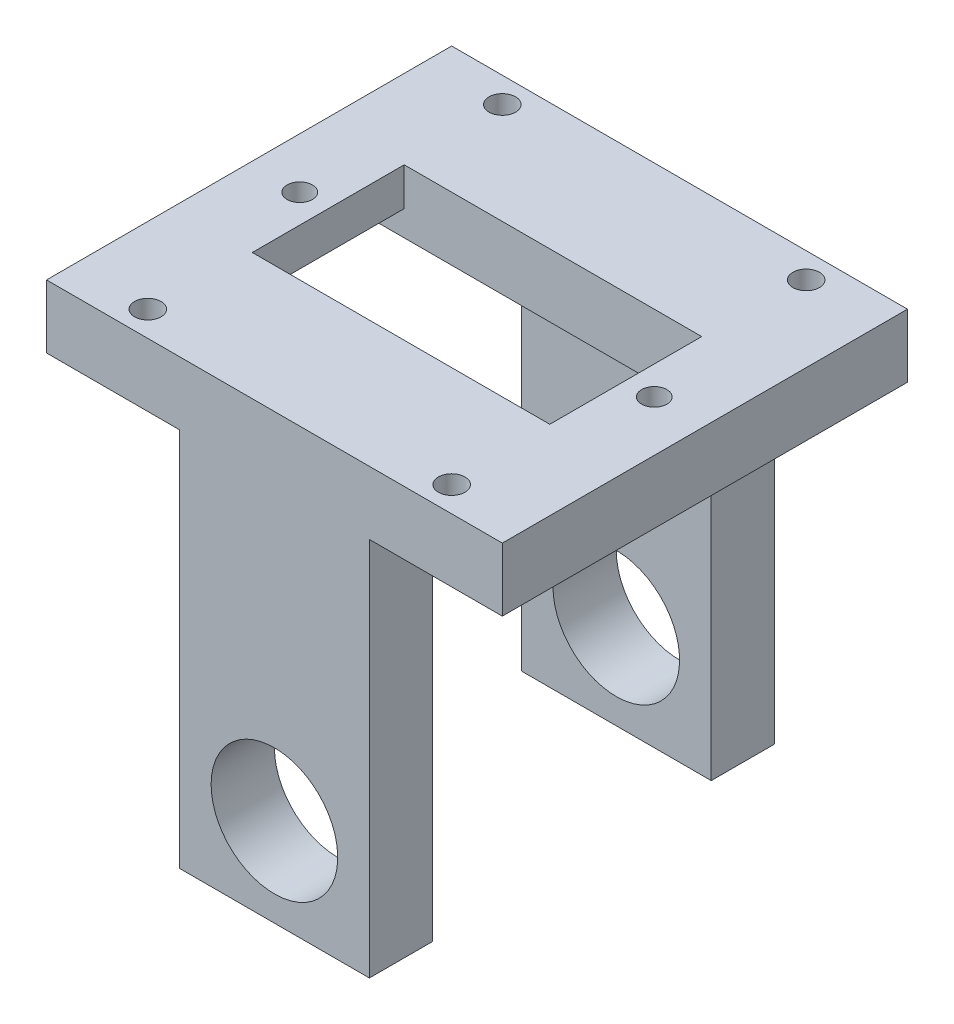
ISO-10303-21;
HEADER;
FILE_DESCRIPTION(('STEP AP214'),'2;1');
FILE_NAME('part.step','',(''),(''),'','','');
FILE_SCHEMA(('AUTOMOTIVE_DESIGN { 1 0 10303 214 1 1 1 1 }'));
ENDSEC;
DATA;
#1=APPLICATION_CONTEXT('core data for automotive mechanical design processes');
#2=APPLICATION_PROTOCOL_DEFINITION('international standard','automotive_design',2000,#1);
#3=PRODUCT_CONTEXT('',#1,'mechanical');
#4=PRODUCT('Part','Part','',(#3));
#5=PRODUCT_RELATED_PRODUCT_CATEGORY('part','',(#4));
#6=PRODUCT_DEFINITION_FORMATION('','',#4);
#7=PRODUCT_DEFINITION_CONTEXT('part definition',#1,'design');
#8=PRODUCT_DEFINITION('design','',#6,#7);
#9=PRODUCT_DEFINITION_SHAPE('','',#8);
#10=(LENGTH_UNIT() NAMED_UNIT(*) SI_UNIT(.MILLI.,.METRE.));
#11=(NAMED_UNIT(*) PLANE_ANGLE_UNIT() SI_UNIT($,.RADIAN.));
#12=(NAMED_UNIT(*) SI_UNIT($,.STERADIAN.) SOLID_ANGLE_UNIT());
#13=UNCERTAINTY_MEASURE_WITH_UNIT(LENGTH_MEASURE(1.E-05),#10,'distance_accuracy_value','');
#14=(GEOMETRIC_REPRESENTATION_CONTEXT(3) GLOBAL_UNCERTAINTY_ASSIGNED_CONTEXT((#13)) GLOBAL_UNIT_ASSIGNED_CONTEXT((#10,
#11,#12)) REPRESENTATION_CONTEXT('',''));
#15=CARTESIAN_POINT('',(0.,0.,0.));
#16=DIRECTION('',(0.,0.,1.));
#17=DIRECTION('',(1.,0.,0.));
#18=AXIS2_PLACEMENT_3D('',#15,#16,#17);
#19=CARTESIAN_POINT('',(0.,0.,0.));
#20=DIRECTION('',(0.,1.,0.));
#21=DIRECTION('',(0.,0.,1.));
#22=AXIS2_PLACEMENT_3D('',#19,#20,#21);
#23=PLANE('',#22);
#24=CARTESIAN_POINT('',(-12.,0.,-14.));
#25=DIRECTION('',(0.,-1.,0.));
#26=DIRECTION('',(0.,0.,1.));
#27=AXIS2_PLACEMENT_3D('',#24,#25,#26);
#28=CIRCLE('',#27,1.05);
#29=CARTESIAN_POINT('',(-12.,0.,-12.95));
#30=VERTEX_POINT('',#29);
#31=EDGE_CURVE('E425',#30,#30,#28,.T.);
#32=ORIENTED_EDGE('',*,*,#31,.F.);
#33=EDGE_LOOP('',(#32));
#34=FACE_BOUND('',#33,.T.);
#35=CARTESIAN_POINT('',(12.,0.,-14.));
#36=DIRECTION('',(0.,-1.,0.));
#37=DIRECTION('',(0.,0.,-1.));
#38=AXIS2_PLACEMENT_3D('',#35,#36,#37);
#39=CIRCLE('',#38,1.05);
#40=CARTESIAN_POINT('',(12.,0.,-15.05));
#41=VERTEX_POINT('',#40);
#42=EDGE_CURVE('E431',#41,#41,#39,.T.);
#43=ORIENTED_EDGE('',*,*,#42,.F.);
#44=EDGE_LOOP('',(#43));
#45=FACE_BOUND('',#44,.T.);
#46=CARTESIAN_POINT('',(12.,0.,14.));
#47=DIRECTION('',(0.,-1.,0.));
#48=DIRECTION('',(0.,0.,1.));
#49=AXIS2_PLACEMENT_3D('',#46,#47,#48);
#50=CIRCLE('',#49,1.05);
#51=CARTESIAN_POINT('',(12.,0.,15.05));
#52=VERTEX_POINT('',#51);
#53=EDGE_CURVE('E437',#52,#52,#50,.T.);
#54=ORIENTED_EDGE('',*,*,#53,.F.);
#55=EDGE_LOOP('',(#54));
#56=FACE_BOUND('',#55,.T.);
#57=CARTESIAN_POINT('',(-12.,0.,14.));
#58=DIRECTION('',(0.,-1.,0.));
#59=DIRECTION('',(0.,0.,-1.));
#60=AXIS2_PLACEMENT_3D('',#57,#58,#59);
#61=CIRCLE('',#60,1.05);
#62=CARTESIAN_POINT('',(-12.,0.,12.95));
#63=VERTEX_POINT('',#62);
#64=EDGE_CURVE('E418',#63,#63,#61,.T.);
#65=ORIENTED_EDGE('',*,*,#64,.F.);
#66=EDGE_LOOP('',(#65));
#67=FACE_BOUND('',#66,.T.);
#68=DIRECTION('',(-1.,0.,0.));
#69=VECTOR('',#68,1.);
#70=CARTESIAN_POINT('',(-16.5,0.,6.));
#71=LINE('',#70,#69);
#72=CARTESIAN_POINT('',(16.5,0.,6.));
#73=VERTEX_POINT('',#72);
#74=CARTESIAN_POINT('',(-16.5,0.,6.));
#75=VERTEX_POINT('',#74);
#76=EDGE_CURVE('E287',#73,#75,#71,.T.);
#77=ORIENTED_EDGE('',*,*,#76,.F.);
#78=DIRECTION('',(0.,0.,1.));
#79=VECTOR('',#78,1.);
#80=CARTESIAN_POINT('',(16.5,0.,6.));
#81=LINE('',#80,#79);
#82=CARTESIAN_POINT('',(16.5,0.,-6.));
#83=VERTEX_POINT('',#82);
#84=EDGE_CURVE('E267',#83,#73,#81,.T.);
#85=ORIENTED_EDGE('',*,*,#84,.F.);
#86=DIRECTION('',(1.,0.,0.));
#87=VECTOR('',#86,1.);
#88=CARTESIAN_POINT('',(-16.5,0.,-6.));
#89=LINE('',#88,#87);
#90=CARTESIAN_POINT('',(-16.5,0.,-6.));
#91=VERTEX_POINT('',#90);
#92=EDGE_CURVE('E274',#91,#83,#89,.T.);
#93=ORIENTED_EDGE('',*,*,#92,.F.);
#94=DIRECTION('',(0.,0.,-1.));
#95=VECTOR('',#94,1.);
#96=CARTESIAN_POINT('',(-16.5,0.,6.));
#97=LINE('',#96,#95);
#98=EDGE_CURVE('E289',#75,#91,#97,.T.);
#99=ORIENTED_EDGE('',*,*,#98,.F.);
#100=EDGE_LOOP('',(#77,#85,#93,#99));
#101=FACE_BOUND('',#100,.T.);
#102=DIRECTION('',(0.,0.,-1.));
#103=VECTOR('',#102,1.);
#104=CARTESIAN_POINT('',(-7.49999999999999,0.,-16.));
#105=LINE('',#104,#103);
#106=CARTESIAN_POINT('',(-7.49999999999999,0.,-11.));
#107=VERTEX_POINT('',#106);
#108=CARTESIAN_POINT('',(-7.49999999999999,0.,-16.));
#109=VERTEX_POINT('',#108);
#110=EDGE_CURVE('E57',#107,#109,#105,.T.);
#111=ORIENTED_EDGE('',*,*,#110,.F.);
#112=DIRECTION('',(-1.,0.,0.));
#113=VECTOR('',#112,1.);
#114=CARTESIAN_POINT('',(-7.49999999999999,0.,-11.));
#115=LINE('',#114,#113);
#116=CARTESIAN_POINT('',(7.50000000000001,0.,-11.));
#117=VERTEX_POINT('',#116);
#118=EDGE_CURVE('E181',#117,#107,#115,.T.);
#119=ORIENTED_EDGE('',*,*,#118,.F.);
#120=DIRECTION('',(0.,0.,1.));
#121=VECTOR('',#120,1.);
#122=CARTESIAN_POINT('',(7.50000000000001,0.,-16.));
#123=LINE('',#122,#121);
#124=CARTESIAN_POINT('',(7.50000000000001,0.,-16.));
#125=VERTEX_POINT('',#124);
#126=EDGE_CURVE('E189',#125,#117,#123,.T.);
#127=ORIENTED_EDGE('',*,*,#126,.F.);
#128=DIRECTION('',(-1.,0.,0.));
#129=VECTOR('',#128,1.);
#130=CARTESIAN_POINT('',(-18.,0.,-16.));
#131=LINE('',#130,#129);
#132=CARTESIAN_POINT('',(18.,0.,-16.));
#133=VERTEX_POINT('',#132);
#134=EDGE_CURVE('E317',#133,#125,#131,.T.);
#135=ORIENTED_EDGE('',*,*,#134,.F.);
#136=DIRECTION('',(0.,0.,-1.));
#137=VECTOR('',#136,1.);
#138=CARTESIAN_POINT('',(18.,0.,-16.));
#139=LINE('',#138,#137);
#140=CARTESIAN_POINT('',(18.,0.,16.));
#141=VERTEX_POINT('',#140);
#142=EDGE_CURVE('E296',#141,#133,#139,.T.);
#143=ORIENTED_EDGE('',*,*,#142,.F.);
#144=DIRECTION('',(1.,0.,0.));
#145=VECTOR('',#144,1.);
#146=CARTESIAN_POINT('',(-18.,0.,16.));
#147=LINE('',#146,#145);
#148=CARTESIAN_POINT('',(7.5,0.,16.));
#149=VERTEX_POINT('',#148);
#150=EDGE_CURVE('E322',#149,#141,#147,.T.);
#151=ORIENTED_EDGE('',*,*,#150,.F.);
#152=DIRECTION('',(0.,0.,1.));
#153=VECTOR('',#152,1.);
#154=CARTESIAN_POINT('',(7.5,0.,16.));
#155=LINE('',#154,#153);
#156=CARTESIAN_POINT('',(7.5,0.,11.));
#157=VERTEX_POINT('',#156);
#158=EDGE_CURVE('E65',#157,#149,#155,.T.);
#159=ORIENTED_EDGE('',*,*,#158,.F.);
#160=DIRECTION('',(1.,0.,0.));
#161=VECTOR('',#160,1.);
#162=CARTESIAN_POINT('',(-7.5,0.,11.));
#163=LINE('',#162,#161);
#164=CARTESIAN_POINT('',(-7.5,0.,11.));
#165=VERTEX_POINT('',#164);
#166=EDGE_CURVE('E214',#165,#157,#163,.T.);
#167=ORIENTED_EDGE('',*,*,#166,.F.);
#168=DIRECTION('',(0.,0.,-1.));
#169=VECTOR('',#168,1.);
#170=CARTESIAN_POINT('',(-7.5,0.,16.));
#171=LINE('',#170,#169);
#172=CARTESIAN_POINT('',(-7.5,0.,16.));
#173=VERTEX_POINT('',#172);
#174=EDGE_CURVE('E200',#173,#165,#171,.T.);
#175=ORIENTED_EDGE('',*,*,#174,.F.);
#176=CARTESIAN_POINT('',(-18.,0.,16.));
#177=VERTEX_POINT('',#176);
#178=EDGE_CURVE('E308',#177,#173,#147,.T.);
#179=ORIENTED_EDGE('',*,*,#178,.F.);
#180=DIRECTION('',(0.,0.,1.));
#181=VECTOR('',#180,1.);
#182=CARTESIAN_POINT('',(-18.,0.,-16.));
#183=LINE('',#182,#181);
#184=CARTESIAN_POINT('',(-18.,0.,-16.));
#185=VERTEX_POINT('',#184);
#186=EDGE_CURVE('E320',#185,#177,#183,.T.);
#187=ORIENTED_EDGE('',*,*,#186,.F.);
#188=EDGE_CURVE('E198',#109,#185,#131,.T.);
#189=ORIENTED_EDGE('',*,*,#188,.F.);
#190=EDGE_LOOP('',(#111,#119,#127,#135,#143,#151,#159,#167,#175,#179,#187,#189));
#191=FACE_BOUND('',#190,.T.);
#192=ADVANCED_FACE('F41',(#34,#45,#56,#67,#101,#191),#23,.F.);
#193=CARTESIAN_POINT('',(0.,2.,0.));
#194=DIRECTION('',(0.,-1.,0.));
#195=DIRECTION('',(0.,0.,-1.));
#196=AXIS2_PLACEMENT_3D('',#193,#194,#195);
#197=PLANE('',#196);
#198=DIRECTION('',(0.,0.,-1.));
#199=VECTOR('',#198,1.);
#200=CARTESIAN_POINT('',(-11.75,2.,0.));
#201=LINE('',#200,#199);
#202=CARTESIAN_POINT('',(-11.75,2.,6.));
#203=VERTEX_POINT('',#202);
#204=CARTESIAN_POINT('',(-11.75,2.,-6.));
#205=VERTEX_POINT('',#204);
#206=EDGE_CURVE('E11',#203,#205,#201,.T.);
#207=ORIENTED_EDGE('',*,*,#206,.F.);
#208=DIRECTION('',(-1.,0.,0.));
#209=VECTOR('',#208,1.);
#210=CARTESIAN_POINT('',(-16.5,2.,6.));
#211=LINE('',#210,#209);
#212=CARTESIAN_POINT('',(-16.5,2.,6.));
#213=VERTEX_POINT('',#212);
#214=EDGE_CURVE('E273',#203,#213,#211,.T.);
#215=ORIENTED_EDGE('',*,*,#214,.T.);
#216=DIRECTION('',(0.,0.,-1.));
#217=VECTOR('',#216,1.);
#218=CARTESIAN_POINT('',(-16.5,2.,6.));
#219=LINE('',#218,#217);
#220=CARTESIAN_POINT('',(-16.5,2.,-6.));
#221=VERTEX_POINT('',#220);
#222=EDGE_CURVE('E278',#213,#221,#219,.T.);
#223=ORIENTED_EDGE('',*,*,#222,.T.);
#224=DIRECTION('',(1.,0.,0.));
#225=VECTOR('',#224,1.);
#226=CARTESIAN_POINT('',(-16.5,2.,-6.));
#227=LINE('',#226,#225);
#228=EDGE_CURVE('E282',#221,#205,#227,.T.);
#229=ORIENTED_EDGE('',*,*,#228,.T.);
#230=EDGE_LOOP('',(#207,#215,#223,#229));
#231=FACE_BOUND('',#230,.T.);
#232=CARTESIAN_POINT('',(-14.,2.,0.));
#233=DIRECTION('',(0.,-1.,0.));
#234=DIRECTION('',(0.,0.,-1.));
#235=AXIS2_PLACEMENT_3D('',#232,#233,#234);
#236=CIRCLE('',#235,1.);
#237=CARTESIAN_POINT('',(-14.,2.,-1.));
#238=VERTEX_POINT('',#237);
#239=EDGE_CURVE('E257',#238,#238,#236,.T.);
#240=ORIENTED_EDGE('',*,*,#239,.F.);
#241=EDGE_LOOP('',(#240));
#242=FACE_BOUND('',#241,.T.);
#243=ADVANCED_FACE('F365',(#231,#242),#197,.T.);
#244=CARTESIAN_POINT('',(18.,5.,-16.));
#245=DIRECTION('',(-1.,0.,0.));
#246=DIRECTION('',(0.,0.,1.));
#247=AXIS2_PLACEMENT_3D('',#244,#245,#246);
#248=PLANE('',#247);
#249=ORIENTED_EDGE('',*,*,#142,.T.);
#250=DIRECTION('',(0.,-1.,0.));
#251=VECTOR('',#250,1.);
#252=CARTESIAN_POINT('',(18.,5.,-16.));
#253=LINE('',#252,#251);
#254=CARTESIAN_POINT('',(18.,5.,-16.));
#255=VERTEX_POINT('',#254);
#256=EDGE_CURVE('E333',#255,#133,#253,.T.);
#257=ORIENTED_EDGE('',*,*,#256,.F.);
#258=DIRECTION('',(0.,0.,-1.));
#259=VECTOR('',#258,1.);
#260=CARTESIAN_POINT('',(18.,5.,-16.));
#261=LINE('',#260,#259);
#262=CARTESIAN_POINT('',(18.,5.,16.));
#263=VERTEX_POINT('',#262);
#264=EDGE_CURVE('E304',#263,#255,#261,.T.);
#265=ORIENTED_EDGE('',*,*,#264,.F.);
#266=DIRECTION('',(0.,-1.,0.));
#267=VECTOR('',#266,1.);
#268=CARTESIAN_POINT('',(18.,5.,16.));
#269=LINE('',#268,#267);
#270=EDGE_CURVE('E314',#263,#141,#269,.T.);
#271=ORIENTED_EDGE('',*,*,#270,.T.);
#272=EDGE_LOOP('',(#249,#257,#265,#271));
#273=FACE_BOUND('',#272,.T.);
#274=ADVANCED_FACE('F43',(#273),#248,.F.);
#275=CARTESIAN_POINT('',(-18.,5.,-16.));
#276=DIRECTION('',(0.,0.,1.));
#277=DIRECTION('',(1.,0.,0.));
#278=AXIS2_PLACEMENT_3D('',#275,#276,#277);
#279=PLANE('',#278);
#280=CARTESIAN_POINT('',(0.,-23.,-16.));
#281=DIRECTION('',(0.,0.,-1.));
#282=DIRECTION('',(-1.,0.,0.));
#283=AXIS2_PLACEMENT_3D('',#280,#281,#282);
#284=CIRCLE('',#283,5.);
#285=CARTESIAN_POINT('',(-5.,-23.,-16.));
#286=VERTEX_POINT('',#285);
#287=EDGE_CURVE('E415',#286,#286,#284,.T.);
#288=ORIENTED_EDGE('',*,*,#287,.F.);
#289=EDGE_LOOP('',(#288));
#290=FACE_BOUND('',#289,.T.);
#291=ORIENTED_EDGE('',*,*,#134,.T.);
#292=DIRECTION('',(0.,1.,0.));
#293=VECTOR('',#292,1.);
#294=CARTESIAN_POINT('',(7.50000000000001,-30.,-16.));
#295=LINE('',#294,#293);
#296=CARTESIAN_POINT('',(7.50000000000001,-30.,-16.));
#297=VERTEX_POINT('',#296);
#298=EDGE_CURVE('E403',#297,#125,#295,.T.);
#299=ORIENTED_EDGE('',*,*,#298,.F.);
#300=DIRECTION('',(1.,0.,0.));
#301=VECTOR('',#300,1.);
#302=CARTESIAN_POINT('',(-7.49999999999999,-30.,-16.));
#303=LINE('',#302,#301);
#304=CARTESIAN_POINT('',(-7.49999999999999,-30.,-16.));
#305=VERTEX_POINT('',#304);
#306=EDGE_CURVE('E207',#305,#297,#303,.T.);
#307=ORIENTED_EDGE('',*,*,#306,.F.);
#308=DIRECTION('',(0.,1.,0.));
#309=VECTOR('',#308,1.);
#310=CARTESIAN_POINT('',(-7.49999999999999,-30.,-16.));
#311=LINE('',#310,#309);
#312=EDGE_CURVE('E404',#305,#109,#311,.T.);
#313=ORIENTED_EDGE('',*,*,#312,.T.);
#314=ORIENTED_EDGE('',*,*,#188,.T.);
#315=DIRECTION('',(0.,-1.,0.));
#316=VECTOR('',#315,1.);
#317=CARTESIAN_POINT('',(-18.,5.,-16.));
#318=LINE('',#317,#316);
#319=CARTESIAN_POINT('',(-18.,5.,-16.));
#320=VERTEX_POINT('',#319);
#321=EDGE_CURVE('E330',#320,#185,#318,.T.);
#322=ORIENTED_EDGE('',*,*,#321,.F.);
#323=DIRECTION('',(-1.,0.,0.));
#324=VECTOR('',#323,1.);
#325=CARTESIAN_POINT('',(-18.,5.,-16.));
#326=LINE('',#325,#324);
#327=EDGE_CURVE('E307',#255,#320,#326,.T.);
#328=ORIENTED_EDGE('',*,*,#327,.F.);
#329=ORIENTED_EDGE('',*,*,#256,.T.);
#330=EDGE_LOOP('',(#291,#299,#307,#313,#314,#322,#328,#329));
#331=FACE_BOUND('',#330,.T.);
#332=ADVANCED_FACE('F392',(#290,#331),#279,.F.);
#333=CARTESIAN_POINT('',(-18.,5.,-16.));
#334=DIRECTION('',(1.,0.,0.));
#335=DIRECTION('',(0.,0.,-1.));
#336=AXIS2_PLACEMENT_3D('',#333,#334,#335);
#337=PLANE('',#336);
#338=ORIENTED_EDGE('',*,*,#186,.T.);
#339=DIRECTION('',(0.,-1.,0.));
#340=VECTOR('',#339,1.);
#341=CARTESIAN_POINT('',(-18.,5.,16.));
#342=LINE('',#341,#340);
#343=CARTESIAN_POINT('',(-18.,5.,16.));
#344=VERTEX_POINT('',#343);
#345=EDGE_CURVE('E327',#344,#177,#342,.T.);
#346=ORIENTED_EDGE('',*,*,#345,.F.);
#347=DIRECTION('',(0.,0.,1.));
#348=VECTOR('',#347,1.);
#349=CARTESIAN_POINT('',(-18.,5.,-16.));
#350=LINE('',#349,#348);
#351=EDGE_CURVE('E310',#320,#344,#350,.T.);
#352=ORIENTED_EDGE('',*,*,#351,.F.);
#353=ORIENTED_EDGE('',*,*,#321,.T.);
#354=EDGE_LOOP('',(#338,#346,#352,#353));
#355=FACE_BOUND('',#354,.T.);
#356=ADVANCED_FACE('F397',(#355),#337,.F.);
#357=CARTESIAN_POINT('',(-18.,5.,16.));
#358=DIRECTION('',(0.,0.,-1.));
#359=DIRECTION('',(-1.,0.,0.));
#360=AXIS2_PLACEMENT_3D('',#357,#358,#359);
#361=PLANE('',#360);
#362=CARTESIAN_POINT('',(0.,-23.,16.));
#363=DIRECTION('',(0.,0.,-1.));
#364=DIRECTION('',(-1.,0.,0.));
#365=AXIS2_PLACEMENT_3D('',#362,#363,#364);
#366=CIRCLE('',#365,5.);
#367=CARTESIAN_POINT('',(-5.,-23.,16.));
#368=VERTEX_POINT('',#367);
#369=EDGE_CURVE('E412',#368,#368,#366,.F.);
#370=ORIENTED_EDGE('',*,*,#369,.F.);
#371=EDGE_LOOP('',(#370));
#372=FACE_BOUND('',#371,.T.);
#373=ORIENTED_EDGE('',*,*,#178,.T.);
#374=DIRECTION('',(0.,1.,0.));
#375=VECTOR('',#374,1.);
#376=CARTESIAN_POINT('',(-7.5,-30.,16.));
#377=LINE('',#376,#375);
#378=CARTESIAN_POINT('',(-7.5,-30.,16.));
#379=VERTEX_POINT('',#378);
#380=EDGE_CURVE('E229',#379,#173,#377,.T.);
#381=ORIENTED_EDGE('',*,*,#380,.F.);
#382=DIRECTION('',(-1.,0.,0.));
#383=VECTOR('',#382,1.);
#384=CARTESIAN_POINT('',(-7.5,-30.,16.));
#385=LINE('',#384,#383);
#386=CARTESIAN_POINT('',(7.5,-30.,16.));
#387=VERTEX_POINT('',#386);
#388=EDGE_CURVE('E213',#387,#379,#385,.T.);
#389=ORIENTED_EDGE('',*,*,#388,.F.);
#390=DIRECTION('',(0.,1.,0.));
#391=VECTOR('',#390,1.);
#392=CARTESIAN_POINT('',(7.5,-30.,16.));
#393=LINE('',#392,#391);
#394=EDGE_CURVE('E232',#387,#149,#393,.T.);
#395=ORIENTED_EDGE('',*,*,#394,.T.);
#396=ORIENTED_EDGE('',*,*,#150,.T.);
#397=ORIENTED_EDGE('',*,*,#270,.F.);
#398=DIRECTION('',(1.,0.,0.));
#399=VECTOR('',#398,1.);
#400=CARTESIAN_POINT('',(-18.,5.,16.));
#401=LINE('',#400,#399);
#402=EDGE_CURVE('E312',#344,#263,#401,.T.);
#403=ORIENTED_EDGE('',*,*,#402,.F.);
#404=ORIENTED_EDGE('',*,*,#345,.T.);
#405=EDGE_LOOP('',(#373,#381,#389,#395,#396,#397,#403,#404));
#406=FACE_BOUND('',#405,.T.);
#407=ADVANCED_FACE('F377',(#372,#406),#361,.F.);
#408=CARTESIAN_POINT('',(0.,5.,0.));
#409=DIRECTION('',(0.,1.,0.));
#410=DIRECTION('',(0.,0.,1.));
#411=AXIS2_PLACEMENT_3D('',#408,#409,#410);
#412=PLANE('',#411);
#413=CARTESIAN_POINT('',(-12.,5.,-14.));
#414=DIRECTION('',(0.,1.,0.));
#415=DIRECTION('',(0.,0.,1.));
#416=AXIS2_PLACEMENT_3D('',#413,#414,#415);
#417=CIRCLE('',#416,1.05);
#418=CARTESIAN_POINT('',(-12.,5.,-12.95));
#419=VERTEX_POINT('',#418);
#420=EDGE_CURVE('E428',#419,#419,#417,.F.);
#421=ORIENTED_EDGE('',*,*,#420,.T.);
#422=EDGE_LOOP('',(#421));
#423=FACE_BOUND('',#422,.T.);
#424=CARTESIAN_POINT('',(12.,5.,-14.));
#425=DIRECTION('',(0.,1.,0.));
#426=DIRECTION('',(0.,0.,1.));
#427=AXIS2_PLACEMENT_3D('',#424,#425,#426);
#428=CIRCLE('',#427,1.05);
#429=CARTESIAN_POINT('',(12.,5.,-12.95));
#430=VERTEX_POINT('',#429);
#431=EDGE_CURVE('E434',#430,#430,#428,.F.);
#432=ORIENTED_EDGE('',*,*,#431,.T.);
#433=EDGE_LOOP('',(#432));
#434=FACE_BOUND('',#433,.T.);
#435=CARTESIAN_POINT('',(12.,5.,14.));
#436=DIRECTION('',(0.,1.,0.));
#437=DIRECTION('',(0.,0.,1.));
#438=AXIS2_PLACEMENT_3D('',#435,#436,#437);
#439=CIRCLE('',#438,1.05);
#440=CARTESIAN_POINT('',(12.,5.,15.05));
#441=VERTEX_POINT('',#440);
#442=EDGE_CURVE('E422',#441,#441,#439,.F.);
#443=ORIENTED_EDGE('',*,*,#442,.T.);
#444=EDGE_LOOP('',(#443));
#445=FACE_BOUND('',#444,.T.);
#446=CARTESIAN_POINT('',(-12.,5.,14.));
#447=DIRECTION('',(0.,1.,0.));
#448=DIRECTION('',(0.,0.,1.));
#449=AXIS2_PLACEMENT_3D('',#446,#447,#448);
#450=CIRCLE('',#449,1.05);
#451=CARTESIAN_POINT('',(-12.,5.,15.05));
#452=VERTEX_POINT('',#451);
#453=EDGE_CURVE('E419',#452,#452,#450,.F.);
#454=ORIENTED_EDGE('',*,*,#453,.T.);
#455=EDGE_LOOP('',(#454));
#456=FACE_BOUND('',#455,.T.);
#457=DIRECTION('',(-1.,0.,0.));
#458=VECTOR('',#457,1.);
#459=CARTESIAN_POINT('',(-11.75,5.,6.));
#460=LINE('',#459,#458);
#461=CARTESIAN_POINT('',(11.75,5.,6.));
#462=VERTEX_POINT('',#461);
#463=CARTESIAN_POINT('',(-11.75,5.,6.));
#464=VERTEX_POINT('',#463);
#465=EDGE_CURVE('E235',#462,#464,#460,.T.);
#466=ORIENTED_EDGE('',*,*,#465,.T.);
#467=DIRECTION('',(0.,0.,-1.));
#468=VECTOR('',#467,1.);
#469=CARTESIAN_POINT('',(-11.75,5.,-6.));
#470=LINE('',#469,#468);
#471=CARTESIAN_POINT('',(-11.75,5.,-6.));
#472=VERTEX_POINT('',#471);
#473=EDGE_CURVE('E248',#464,#472,#470,.T.);
#474=ORIENTED_EDGE('',*,*,#473,.T.);
#475=DIRECTION('',(1.,0.,0.));
#476=VECTOR('',#475,1.);
#477=CARTESIAN_POINT('',(-11.75,5.,-6.));
#478=LINE('',#477,#476);
#479=CARTESIAN_POINT('',(11.75,5.,-6.));
#480=VERTEX_POINT('',#479);
#481=EDGE_CURVE('E244',#472,#480,#478,.T.);
#482=ORIENTED_EDGE('',*,*,#481,.T.);
#483=DIRECTION('',(0.,0.,1.));
#484=VECTOR('',#483,1.);
#485=CARTESIAN_POINT('',(11.75,5.,-6.));
#486=LINE('',#485,#484);
#487=EDGE_CURVE('E239',#480,#462,#486,.T.);
#488=ORIENTED_EDGE('',*,*,#487,.T.);
#489=EDGE_LOOP('',(#466,#474,#482,#488));
#490=FACE_BOUND('',#489,.T.);
#491=CARTESIAN_POINT('',(-14.,5.,0.));
#492=DIRECTION('',(0.,-1.,0.));
#493=DIRECTION('',(0.,0.,-1.));
#494=AXIS2_PLACEMENT_3D('',#491,#492,#493);
#495=CIRCLE('',#494,1.);
#496=CARTESIAN_POINT('',(-14.,5.,-1.));
#497=VERTEX_POINT('',#496);
#498=EDGE_CURVE('E258',#497,#497,#495,.T.);
#499=ORIENTED_EDGE('',*,*,#498,.T.);
#500=EDGE_LOOP('',(#499));
#501=FACE_BOUND('',#500,.T.);
#502=CARTESIAN_POINT('',(14.,5.,0.));
#503=DIRECTION('',(0.,-1.,0.));
#504=DIRECTION('',(0.,0.,-1.));
#505=AXIS2_PLACEMENT_3D('',#502,#503,#504);
#506=CIRCLE('',#505,1.);
#507=CARTESIAN_POINT('',(14.,5.,-1.));
#508=VERTEX_POINT('',#507);
#509=EDGE_CURVE('E264',#508,#508,#506,.T.);
#510=ORIENTED_EDGE('',*,*,#509,.T.);
#511=EDGE_LOOP('',(#510));
#512=FACE_BOUND('',#511,.T.);
#513=ORIENTED_EDGE('',*,*,#264,.T.);
#514=ORIENTED_EDGE('',*,*,#327,.T.);
#515=ORIENTED_EDGE('',*,*,#351,.T.);
#516=ORIENTED_EDGE('',*,*,#402,.T.);
#517=EDGE_LOOP('',(#513,#514,#515,#516));
#518=FACE_BOUND('',#517,.T.);
#519=ADVANCED_FACE('F374',(#423,#434,#445,#456,#490,#501,#512,#518),#412,.T.);
#520=CARTESIAN_POINT('',(16.5,2.,6.));
#521=DIRECTION('',(1.,0.,0.));
#522=DIRECTION('',(0.,0.,-1.));
#523=AXIS2_PLACEMENT_3D('',#520,#521,#522);
#524=PLANE('',#523);
#525=ORIENTED_EDGE('',*,*,#84,.T.);
#526=DIRECTION('',(0.,-1.,0.));
#527=VECTOR('',#526,1.);
#528=CARTESIAN_POINT('',(16.5,2.,6.));
#529=LINE('',#528,#527);
#530=CARTESIAN_POINT('',(16.5,2.,6.));
#531=VERTEX_POINT('',#530);
#532=EDGE_CURVE('E285',#531,#73,#529,.T.);
#533=ORIENTED_EDGE('',*,*,#532,.F.);
#534=DIRECTION('',(0.,0.,1.));
#535=VECTOR('',#534,1.);
#536=CARTESIAN_POINT('',(16.5,2.,6.));
#537=LINE('',#536,#535);
#538=CARTESIAN_POINT('',(16.5,2.,-6.));
#539=VERTEX_POINT('',#538);
#540=EDGE_CURVE('E270',#539,#531,#537,.T.);
#541=ORIENTED_EDGE('',*,*,#540,.F.);
#542=DIRECTION('',(0.,-1.,0.));
#543=VECTOR('',#542,1.);
#544=CARTESIAN_POINT('',(16.5,2.,-6.));
#545=LINE('',#544,#543);
#546=EDGE_CURVE('E293',#539,#83,#545,.T.);
#547=ORIENTED_EDGE('',*,*,#546,.T.);
#548=EDGE_LOOP('',(#525,#533,#541,#547));
#549=FACE_BOUND('',#548,.T.);
#550=ADVANCED_FACE('F352',(#549),#524,.F.);
#551=CARTESIAN_POINT('',(-16.5,2.,-6.));
#552=DIRECTION('',(0.,0.,-1.));
#553=DIRECTION('',(-1.,0.,0.));
#554=AXIS2_PLACEMENT_3D('',#551,#552,#553);
#555=PLANE('',#554);
#556=CARTESIAN_POINT('',(11.75,2.,-6.));
#557=VERTEX_POINT('',#556);
#558=EDGE_CURVE('E281',#557,#539,#227,.T.);
#559=ORIENTED_EDGE('',*,*,#558,.F.);
#560=DIRECTION('',(0.,-1.,0.));
#561=VECTOR('',#560,1.);
#562=CARTESIAN_POINT('',(11.75,31.3865496039175,-6.));
#563=LINE('',#562,#561);
#564=EDGE_CURVE('E243',#480,#557,#563,.T.);
#565=ORIENTED_EDGE('',*,*,#564,.F.);
#566=ORIENTED_EDGE('',*,*,#481,.F.);
#567=DIRECTION('',(0.,-1.,0.));
#568=VECTOR('',#567,1.);
#569=CARTESIAN_POINT('',(-11.75,31.3865496039175,-6.));
#570=LINE('',#569,#568);
#571=EDGE_CURVE('E247',#472,#205,#570,.T.);
#572=ORIENTED_EDGE('',*,*,#571,.T.);
#573=ORIENTED_EDGE('',*,*,#228,.F.);
#574=DIRECTION('',(0.,-1.,0.));
#575=VECTOR('',#574,1.);
#576=CARTESIAN_POINT('',(-16.5,2.,-6.));
#577=LINE('',#576,#575);
#578=EDGE_CURVE('E297',#221,#91,#577,.T.);
#579=ORIENTED_EDGE('',*,*,#578,.T.);
#580=ORIENTED_EDGE('',*,*,#92,.T.);
#581=ORIENTED_EDGE('',*,*,#546,.F.);
#582=EDGE_LOOP('',(#559,#565,#566,#572,#573,#579,#580,#581));
#583=FACE_BOUND('',#582,.T.);
#584=ADVANCED_FACE('F372',(#583),#555,.F.);
#585=CARTESIAN_POINT('',(-16.5,2.,6.));
#586=DIRECTION('',(-1.,0.,0.));
#587=DIRECTION('',(0.,0.,1.));
#588=AXIS2_PLACEMENT_3D('',#585,#586,#587);
#589=PLANE('',#588);
#590=ORIENTED_EDGE('',*,*,#98,.T.);
#591=ORIENTED_EDGE('',*,*,#578,.F.);
#592=ORIENTED_EDGE('',*,*,#222,.F.);
#593=DIRECTION('',(0.,-1.,0.));
#594=VECTOR('',#593,1.);
#595=CARTESIAN_POINT('',(-16.5,2.,6.));
#596=LINE('',#595,#594);
#597=EDGE_CURVE('E299',#213,#75,#596,.T.);
#598=ORIENTED_EDGE('',*,*,#597,.T.);
#599=EDGE_LOOP('',(#590,#591,#592,#598));
#600=FACE_BOUND('',#599,.T.);
#601=ADVANCED_FACE('F360',(#600),#589,.F.);
#602=CARTESIAN_POINT('',(-16.5,2.,6.));
#603=DIRECTION('',(0.,0.,1.));
#604=DIRECTION('',(1.,0.,0.));
#605=AXIS2_PLACEMENT_3D('',#602,#603,#604);
#606=PLANE('',#605);
#607=ORIENTED_EDGE('',*,*,#76,.T.);
#608=ORIENTED_EDGE('',*,*,#597,.F.);
#609=ORIENTED_EDGE('',*,*,#214,.F.);
#610=DIRECTION('',(0.,-1.,0.));
#611=VECTOR('',#610,1.);
#612=CARTESIAN_POINT('',(-11.75,31.3865496039175,6.));
#613=LINE('',#612,#611);
#614=EDGE_CURVE('E238',#464,#203,#613,.T.);
#615=ORIENTED_EDGE('',*,*,#614,.F.);
#616=ORIENTED_EDGE('',*,*,#465,.F.);
#617=DIRECTION('',(0.,-1.,0.));
#618=VECTOR('',#617,1.);
#619=CARTESIAN_POINT('',(11.75,31.3865496039175,6.));
#620=LINE('',#619,#618);
#621=CARTESIAN_POINT('',(11.75,2.,6.));
#622=VERTEX_POINT('',#621);
#623=EDGE_CURVE('E242',#462,#622,#620,.T.);
#624=ORIENTED_EDGE('',*,*,#623,.T.);
#625=EDGE_CURVE('E275',#531,#622,#211,.T.);
#626=ORIENTED_EDGE('',*,*,#625,.F.);
#627=ORIENTED_EDGE('',*,*,#532,.T.);
#628=EDGE_LOOP('',(#607,#608,#609,#615,#616,#624,#626,#627));
#629=FACE_BOUND('',#628,.T.);
#630=ADVANCED_FACE('F345',(#629),#606,.F.);
#631=DIRECTION('',(0.,0.,1.));
#632=VECTOR('',#631,1.);
#633=CARTESIAN_POINT('',(11.75,2.,0.));
#634=LINE('',#633,#632);
#635=EDGE_CURVE('E50',#557,#622,#634,.T.);
#636=ORIENTED_EDGE('',*,*,#635,.F.);
#637=ORIENTED_EDGE('',*,*,#558,.T.);
#638=ORIENTED_EDGE('',*,*,#540,.T.);
#639=ORIENTED_EDGE('',*,*,#625,.T.);
#640=EDGE_LOOP('',(#636,#637,#638,#639));
#641=FACE_BOUND('',#640,.T.);
#642=CARTESIAN_POINT('',(14.,2.,0.));
#643=DIRECTION('',(0.,-1.,0.));
#644=DIRECTION('',(0.,0.,-1.));
#645=AXIS2_PLACEMENT_3D('',#642,#643,#644);
#646=CIRCLE('',#645,1.);
#647=CARTESIAN_POINT('',(14.,2.,-1.));
#648=VERTEX_POINT('',#647);
#649=EDGE_CURVE('E261',#648,#648,#646,.T.);
#650=ORIENTED_EDGE('',*,*,#649,.F.);
#651=EDGE_LOOP('',(#650));
#652=FACE_BOUND('',#651,.T.);
#653=ADVANCED_FACE('F347',(#641,#652),#197,.T.);
#654=CARTESIAN_POINT('',(14.,5.,0.));
#655=DIRECTION('',(0.,-1.,0.));
#656=DIRECTION('',(0.,0.,-1.));
#657=AXIS2_PLACEMENT_3D('',#654,#655,#656);
#658=CYLINDRICAL_SURFACE('',#657,1.);
#659=ORIENTED_EDGE('',*,*,#509,.F.);
#660=EDGE_LOOP('',(#659));
#661=FACE_BOUND('',#660,.T.);
#662=ORIENTED_EDGE('',*,*,#649,.T.);
#663=EDGE_LOOP('',(#662));
#664=FACE_BOUND('',#663,.T.);
#665=ADVANCED_FACE('F508',(#661,#664),#658,.F.);
#666=CARTESIAN_POINT('',(-14.,5.,0.));
#667=DIRECTION('',(0.,-1.,0.));
#668=DIRECTION('',(0.,0.,-1.));
#669=AXIS2_PLACEMENT_3D('',#666,#667,#668);
#670=CYLINDRICAL_SURFACE('',#669,1.);
#671=ORIENTED_EDGE('',*,*,#498,.F.);
#672=EDGE_LOOP('',(#671));
#673=FACE_BOUND('',#672,.T.);
#674=ORIENTED_EDGE('',*,*,#239,.T.);
#675=EDGE_LOOP('',(#674));
#676=FACE_BOUND('',#675,.T.);
#677=ADVANCED_FACE('F505',(#673,#676),#670,.F.);
#678=CARTESIAN_POINT('',(-11.75,31.3865496039175,-6.));
#679=DIRECTION('',(-1.,0.,0.));
#680=DIRECTION('',(0.,0.,1.));
#681=AXIS2_PLACEMENT_3D('',#678,#679,#680);
#682=PLANE('',#681);
#683=ORIENTED_EDGE('',*,*,#206,.T.);
#684=ORIENTED_EDGE('',*,*,#571,.F.);
#685=ORIENTED_EDGE('',*,*,#473,.F.);
#686=ORIENTED_EDGE('',*,*,#614,.T.);
#687=EDGE_LOOP('',(#683,#684,#685,#686));
#688=FACE_BOUND('',#687,.T.);
#689=ADVANCED_FACE('F370',(#688),#682,.F.);
#690=CARTESIAN_POINT('',(11.75,31.3865496039175,-6.));
#691=DIRECTION('',(1.,0.,0.));
#692=DIRECTION('',(0.,0.,-1.));
#693=AXIS2_PLACEMENT_3D('',#690,#691,#692);
#694=PLANE('',#693);
#695=ORIENTED_EDGE('',*,*,#635,.T.);
#696=ORIENTED_EDGE('',*,*,#623,.F.);
#697=ORIENTED_EDGE('',*,*,#487,.F.);
#698=ORIENTED_EDGE('',*,*,#564,.T.);
#699=EDGE_LOOP('',(#695,#696,#697,#698));
#700=FACE_BOUND('',#699,.T.);
#701=ADVANCED_FACE('F338',(#700),#694,.F.);
#702=CARTESIAN_POINT('',(7.5,-30.,16.));
#703=DIRECTION('',(-1.,0.,0.));
#704=DIRECTION('',(0.,0.,1.));
#705=AXIS2_PLACEMENT_3D('',#702,#703,#704);
#706=PLANE('',#705);
#707=ORIENTED_EDGE('',*,*,#158,.T.);
#708=ORIENTED_EDGE('',*,*,#394,.F.);
#709=DIRECTION('',(0.,0.,1.));
#710=VECTOR('',#709,1.);
#711=CARTESIAN_POINT('',(7.5,-30.,16.));
#712=LINE('',#711,#710);
#713=CARTESIAN_POINT('',(7.5,-30.,11.));
#714=VERTEX_POINT('',#713);
#715=EDGE_CURVE('E210',#714,#387,#712,.T.);
#716=ORIENTED_EDGE('',*,*,#715,.F.);
#717=DIRECTION('',(0.,1.,0.));
#718=VECTOR('',#717,1.);
#719=CARTESIAN_POINT('',(7.5,-30.,11.));
#720=LINE('',#719,#718);
#721=EDGE_CURVE('E219',#714,#157,#720,.T.);
#722=ORIENTED_EDGE('',*,*,#721,.T.);
#723=EDGE_LOOP('',(#707,#708,#716,#722));
#724=FACE_BOUND('',#723,.T.);
#725=ADVANCED_FACE('F496',(#724),#706,.F.);
#726=CARTESIAN_POINT('',(-7.5,-30.,16.));
#727=DIRECTION('',(1.,0.,0.));
#728=DIRECTION('',(0.,0.,-1.));
#729=AXIS2_PLACEMENT_3D('',#726,#727,#728);
#730=PLANE('',#729);
#731=ORIENTED_EDGE('',*,*,#174,.T.);
#732=DIRECTION('',(0.,1.,0.));
#733=VECTOR('',#732,1.);
#734=CARTESIAN_POINT('',(-7.5,-30.,11.));
#735=LINE('',#734,#733);
#736=CARTESIAN_POINT('',(-7.5,-30.,11.));
#737=VERTEX_POINT('',#736);
#738=EDGE_CURVE('E226',#737,#165,#735,.T.);
#739=ORIENTED_EDGE('',*,*,#738,.F.);
#740=DIRECTION('',(0.,0.,-1.));
#741=VECTOR('',#740,1.);
#742=CARTESIAN_POINT('',(-7.5,-30.,16.));
#743=LINE('',#742,#741);
#744=EDGE_CURVE('E216',#379,#737,#743,.T.);
#745=ORIENTED_EDGE('',*,*,#744,.F.);
#746=ORIENTED_EDGE('',*,*,#380,.T.);
#747=EDGE_LOOP('',(#731,#739,#745,#746));
#748=FACE_BOUND('',#747,.T.);
#749=ADVANCED_FACE('F492',(#748),#730,.F.);
#750=CARTESIAN_POINT('',(-7.5,-30.,11.));
#751=DIRECTION('',(0.,0.,1.));
#752=DIRECTION('',(1.,0.,0.));
#753=AXIS2_PLACEMENT_3D('',#750,#751,#752);
#754=PLANE('',#753);
#755=CARTESIAN_POINT('',(0.,-23.,11.));
#756=DIRECTION('',(0.,0.,1.));
#757=DIRECTION('',(1.,0.,0.));
#758=AXIS2_PLACEMENT_3D('',#755,#756,#757);
#759=CIRCLE('',#758,5.);
#760=CARTESIAN_POINT('',(5.,-23.,11.));
#761=VERTEX_POINT('',#760);
#762=EDGE_CURVE('E407',#761,#761,#759,.T.);
#763=ORIENTED_EDGE('',*,*,#762,.T.);
#764=EDGE_LOOP('',(#763));
#765=FACE_BOUND('',#764,.T.);
#766=ORIENTED_EDGE('',*,*,#166,.T.);
#767=ORIENTED_EDGE('',*,*,#721,.F.);
#768=DIRECTION('',(1.,0.,0.));
#769=VECTOR('',#768,1.);
#770=CARTESIAN_POINT('',(-7.5,-30.,11.));
#771=LINE('',#770,#769);
#772=EDGE_CURVE('E218',#737,#714,#771,.T.);
#773=ORIENTED_EDGE('',*,*,#772,.F.);
#774=ORIENTED_EDGE('',*,*,#738,.T.);
#775=EDGE_LOOP('',(#766,#767,#773,#774));
#776=FACE_BOUND('',#775,.T.);
#777=ADVANCED_FACE('F488',(#765,#776),#754,.F.);
#778=CARTESIAN_POINT('',(0.,-30.,0.));
#779=DIRECTION('',(0.,-1.,0.));
#780=DIRECTION('',(0.,0.,-1.));
#781=AXIS2_PLACEMENT_3D('',#778,#779,#780);
#782=PLANE('',#781);
#783=ORIENTED_EDGE('',*,*,#715,.T.);
#784=ORIENTED_EDGE('',*,*,#388,.T.);
#785=ORIENTED_EDGE('',*,*,#744,.T.);
#786=ORIENTED_EDGE('',*,*,#772,.T.);
#787=EDGE_LOOP('',(#783,#784,#785,#786));
#788=FACE_BOUND('',#787,.T.);
#789=ADVANCED_FACE('F476',(#788),#782,.T.);
#790=CARTESIAN_POINT('',(-7.49999999999999,-30.,-16.));
#791=DIRECTION('',(1.,0.,0.));
#792=DIRECTION('',(0.,0.,-1.));
#793=AXIS2_PLACEMENT_3D('',#790,#791,#792);
#794=PLANE('',#793);
#795=ORIENTED_EDGE('',*,*,#110,.T.);
#796=ORIENTED_EDGE('',*,*,#312,.F.);
#797=DIRECTION('',(0.,0.,-1.));
#798=VECTOR('',#797,1.);
#799=CARTESIAN_POINT('',(-7.49999999999999,-30.,-16.));
#800=LINE('',#799,#798);
#801=CARTESIAN_POINT('',(-7.49999999999999,-30.,-11.));
#802=VERTEX_POINT('',#801);
#803=EDGE_CURVE('E190',#802,#305,#800,.T.);
#804=ORIENTED_EDGE('',*,*,#803,.F.);
#805=DIRECTION('',(0.,1.,0.));
#806=VECTOR('',#805,1.);
#807=CARTESIAN_POINT('',(-7.49999999999999,-30.,-11.));
#808=LINE('',#807,#806);
#809=EDGE_CURVE('E184',#802,#107,#808,.T.);
#810=ORIENTED_EDGE('',*,*,#809,.T.);
#811=EDGE_LOOP('',(#795,#796,#804,#810));
#812=FACE_BOUND('',#811,.T.);
#813=ADVANCED_FACE('F192',(#812),#794,.F.);
#814=CARTESIAN_POINT('',(7.50000000000001,-30.,-16.));
#815=DIRECTION('',(-1.,0.,0.));
#816=DIRECTION('',(0.,0.,1.));
#817=AXIS2_PLACEMENT_3D('',#814,#815,#816);
#818=PLANE('',#817);
#819=ORIENTED_EDGE('',*,*,#126,.T.);
#820=DIRECTION('',(0.,1.,0.));
#821=VECTOR('',#820,1.);
#822=CARTESIAN_POINT('',(7.50000000000001,-30.,-11.));
#823=LINE('',#822,#821);
#824=CARTESIAN_POINT('',(7.50000000000001,-30.,-11.));
#825=VERTEX_POINT('',#824);
#826=EDGE_CURVE('E187',#825,#117,#823,.T.);
#827=ORIENTED_EDGE('',*,*,#826,.F.);
#828=DIRECTION('',(0.,0.,1.));
#829=VECTOR('',#828,1.);
#830=CARTESIAN_POINT('',(7.50000000000001,-30.,-16.));
#831=LINE('',#830,#829);
#832=EDGE_CURVE('E205',#297,#825,#831,.T.);
#833=ORIENTED_EDGE('',*,*,#832,.F.);
#834=ORIENTED_EDGE('',*,*,#298,.T.);
#835=EDGE_LOOP('',(#819,#827,#833,#834));
#836=FACE_BOUND('',#835,.T.);
#837=ADVANCED_FACE('F401',(#836),#818,.F.);
#838=CARTESIAN_POINT('',(-7.49999999999999,-30.,-11.));
#839=DIRECTION('',(0.,0.,-1.));
#840=DIRECTION('',(-1.,0.,0.));
#841=AXIS2_PLACEMENT_3D('',#838,#839,#840);
#842=PLANE('',#841);
#843=CARTESIAN_POINT('',(0.,-23.,-11.));
#844=DIRECTION('',(0.,0.,-1.));
#845=DIRECTION('',(-1.,0.,0.));
#846=AXIS2_PLACEMENT_3D('',#843,#844,#845);
#847=CIRCLE('',#846,5.);
#848=CARTESIAN_POINT('',(-5.,-23.,-11.));
#849=VERTEX_POINT('',#848);
#850=EDGE_CURVE('E45',#849,#849,#847,.T.);
#851=ORIENTED_EDGE('',*,*,#850,.T.);
#852=EDGE_LOOP('',(#851));
#853=FACE_BOUND('',#852,.T.);
#854=ORIENTED_EDGE('',*,*,#118,.T.);
#855=ORIENTED_EDGE('',*,*,#809,.F.);
#856=DIRECTION('',(-1.,0.,0.));
#857=VECTOR('',#856,1.);
#858=CARTESIAN_POINT('',(-7.49999999999999,-30.,-11.));
#859=LINE('',#858,#857);
#860=EDGE_CURVE('E194',#825,#802,#859,.T.);
#861=ORIENTED_EDGE('',*,*,#860,.F.);
#862=ORIENTED_EDGE('',*,*,#826,.T.);
#863=EDGE_LOOP('',(#854,#855,#861,#862));
#864=FACE_BOUND('',#863,.T.);
#865=ADVANCED_FACE('F182',(#853,#864),#842,.F.);
#866=CARTESIAN_POINT('',(0.,-30.,0.));
#867=DIRECTION('',(0.,1.,0.));
#868=DIRECTION('',(0.,0.,1.));
#869=AXIS2_PLACEMENT_3D('',#866,#867,#868);
#870=PLANE('',#869);
#871=ORIENTED_EDGE('',*,*,#803,.T.);
#872=ORIENTED_EDGE('',*,*,#306,.T.);
#873=ORIENTED_EDGE('',*,*,#832,.T.);
#874=ORIENTED_EDGE('',*,*,#860,.T.);
#875=EDGE_LOOP('',(#871,#872,#873,#874));
#876=FACE_BOUND('',#875,.T.);
#877=ADVANCED_FACE('F481',(#876),#870,.F.);
#878=CARTESIAN_POINT('',(0.,-23.,30.142135623731));
#879=DIRECTION('',(0.,0.,-1.));
#880=DIRECTION('',(-1.,0.,0.));
#881=AXIS2_PLACEMENT_3D('',#878,#879,#880);
#882=CYLINDRICAL_SURFACE('',#881,5.);
#883=ORIENTED_EDGE('',*,*,#287,.T.);
#884=EDGE_LOOP('',(#883));
#885=FACE_BOUND('',#884,.T.);
#886=ORIENTED_EDGE('',*,*,#850,.F.);
#887=EDGE_LOOP('',(#886));
#888=FACE_BOUND('',#887,.T.);
#889=ADVANCED_FACE('F466',(#885,#888),#882,.F.);
#890=ORIENTED_EDGE('',*,*,#369,.T.);
#891=EDGE_LOOP('',(#890));
#892=FACE_BOUND('',#891,.T.);
#893=ORIENTED_EDGE('',*,*,#762,.F.);
#894=EDGE_LOOP('',(#893));
#895=FACE_BOUND('',#894,.T.);
#896=ADVANCED_FACE('F460',(#892,#895),#882,.F.);
#897=CARTESIAN_POINT('',(-12.,5.001,14.));
#898=DIRECTION('',(0.,-1.,0.));
#899=DIRECTION('',(0.,0.,-1.));
#900=AXIS2_PLACEMENT_3D('',#897,#898,#899);
#901=CYLINDRICAL_SURFACE('',#900,1.05);
#902=ORIENTED_EDGE('',*,*,#453,.F.);
#903=EDGE_LOOP('',(#902));
#904=FACE_BOUND('',#903,.T.);
#905=ORIENTED_EDGE('',*,*,#64,.T.);
#906=EDGE_LOOP('',(#905));
#907=FACE_BOUND('',#906,.T.);
#908=ADVANCED_FACE('F449',(#904,#907),#901,.F.);
#909=CARTESIAN_POINT('',(12.,5.001,14.));
#910=DIRECTION('',(0.,-1.,0.));
#911=DIRECTION('',(0.,0.,-1.));
#912=AXIS2_PLACEMENT_3D('',#909,#910,#911);
#913=CYLINDRICAL_SURFACE('',#912,1.05);
#914=ORIENTED_EDGE('',*,*,#442,.F.);
#915=EDGE_LOOP('',(#914));
#916=FACE_BOUND('',#915,.T.);
#917=ORIENTED_EDGE('',*,*,#53,.T.);
#918=EDGE_LOOP('',(#917));
#919=FACE_BOUND('',#918,.T.);
#920=ADVANCED_FACE('F445',(#916,#919),#913,.F.);
#921=CARTESIAN_POINT('',(12.,5.001,-14.));
#922=DIRECTION('',(0.,-1.,0.));
#923=DIRECTION('',(0.,0.,-1.));
#924=AXIS2_PLACEMENT_3D('',#921,#922,#923);
#925=CYLINDRICAL_SURFACE('',#924,1.05);
#926=ORIENTED_EDGE('',*,*,#431,.F.);
#927=EDGE_LOOP('',(#926));
#928=FACE_BOUND('',#927,.T.);
#929=ORIENTED_EDGE('',*,*,#42,.T.);
#930=EDGE_LOOP('',(#929));
#931=FACE_BOUND('',#930,.T.);
#932=ADVANCED_FACE('F448',(#928,#931),#925,.F.);
#933=CARTESIAN_POINT('',(-12.,5.001,-14.));
#934=DIRECTION('',(0.,-1.,0.));
#935=DIRECTION('',(0.,0.,-1.));
#936=AXIS2_PLACEMENT_3D('',#933,#934,#935);
#937=CYLINDRICAL_SURFACE('',#936,1.05);
#938=ORIENTED_EDGE('',*,*,#420,.F.);
#939=EDGE_LOOP('',(#938));
#940=FACE_BOUND('',#939,.T.);
#941=ORIENTED_EDGE('',*,*,#31,.T.);
#942=EDGE_LOOP('',(#941));
#943=FACE_BOUND('',#942,.T.);
#944=ADVANCED_FACE('F471',(#940,#943),#937,.F.);
#945=CLOSED_SHELL('',(#192,#243,#274,#332,#356,#407,#519,#550,#584,#601,#630,#653,#665,#677,
#689,#701,#725,#749,#777,#789,#813,#837,#865,#877,#889,#896,#908,#920,#932,#944));
#946=MANIFOLD_SOLID_BREP('B2',#945);
#947=ADVANCED_BREP_SHAPE_REPRESENTATION('',(#18,#946),#14);
#948=SHAPE_DEFINITION_REPRESENTATION(#9,#947);
ENDSEC;
END-ISO-10303-21;
